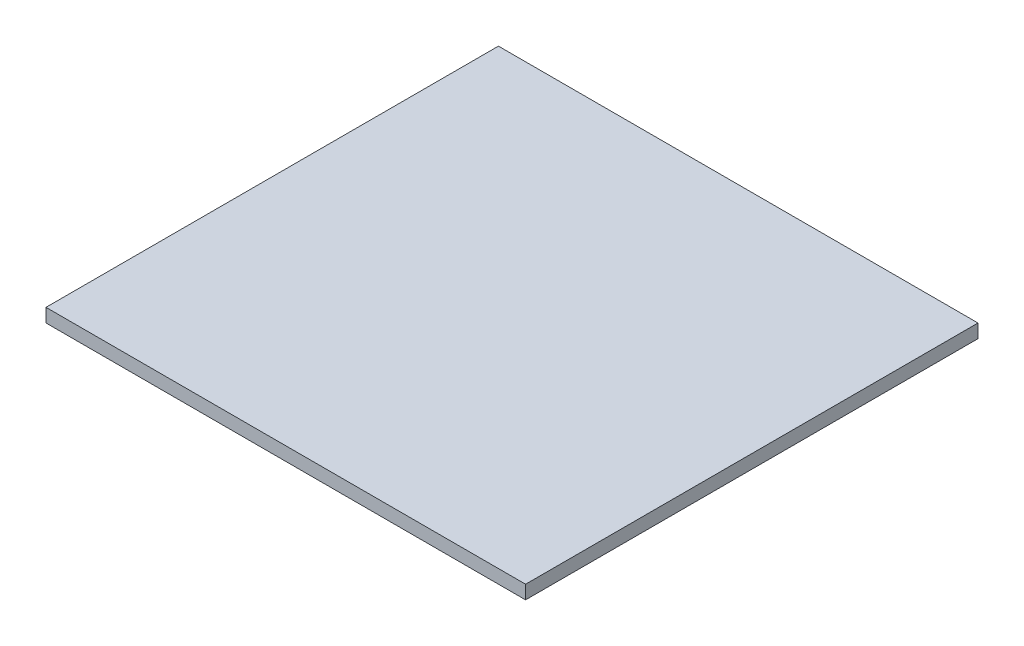
ISO-10303-21;
HEADER;
FILE_DESCRIPTION(('STEP AP214'),'2;1');
FILE_NAME('part.step','',(''),(''),'','','');
FILE_SCHEMA(('AUTOMOTIVE_DESIGN { 1 0 10303 214 1 1 1 1 }'));
ENDSEC;
DATA;
#1=APPLICATION_CONTEXT('core data for automotive mechanical design processes');
#2=APPLICATION_PROTOCOL_DEFINITION('international standard','automotive_design',2000,#1);
#3=PRODUCT_CONTEXT('',#1,'mechanical');
#4=PRODUCT('Part','Part','',(#3));
#5=PRODUCT_RELATED_PRODUCT_CATEGORY('part','',(#4));
#6=PRODUCT_DEFINITION_FORMATION('','',#4);
#7=PRODUCT_DEFINITION_CONTEXT('part definition',#1,'design');
#8=PRODUCT_DEFINITION('design','',#6,#7);
#9=PRODUCT_DEFINITION_SHAPE('','',#8);
#10=(LENGTH_UNIT() NAMED_UNIT(*) SI_UNIT(.MILLI.,.METRE.));
#11=(NAMED_UNIT(*) PLANE_ANGLE_UNIT() SI_UNIT($,.RADIAN.));
#12=(NAMED_UNIT(*) SI_UNIT($,.STERADIAN.) SOLID_ANGLE_UNIT());
#13=UNCERTAINTY_MEASURE_WITH_UNIT(LENGTH_MEASURE(1.E-05),#10,'distance_accuracy_value','');
#14=(GEOMETRIC_REPRESENTATION_CONTEXT(3) GLOBAL_UNCERTAINTY_ASSIGNED_CONTEXT((#13)) GLOBAL_UNIT_ASSIGNED_CONTEXT((#10,
#11,#12)) REPRESENTATION_CONTEXT('',''));
#15=CARTESIAN_POINT('',(0.,0.,0.));
#16=DIRECTION('',(0.,0.,1.));
#17=DIRECTION('',(1.,0.,0.));
#18=AXIS2_PLACEMENT_3D('',#15,#16,#17);
#19=CARTESIAN_POINT('',(79.5,4.5,75.));
#20=DIRECTION('',(-1.,0.,0.));
#21=DIRECTION('',(0.,0.,1.));
#22=AXIS2_PLACEMENT_3D('',#19,#20,#21);
#23=PLANE('',#22);
#24=DIRECTION('',(0.,0.,-1.));
#25=VECTOR('',#24,1.);
#26=CARTESIAN_POINT('',(79.5,0.,75.));
#27=LINE('',#26,#25);
#28=CARTESIAN_POINT('',(79.5,0.,75.));
#29=VERTEX_POINT('',#28);
#30=CARTESIAN_POINT('',(79.5,0.,-75.));
#31=VERTEX_POINT('',#30);
#32=EDGE_CURVE('E110',#29,#31,#27,.T.);
#33=ORIENTED_EDGE('',*,*,#32,.T.);
#34=DIRECTION('',(0.,-1.,0.));
#35=VECTOR('',#34,1.);
#36=CARTESIAN_POINT('',(79.5,4.5,-75.));
#37=LINE('',#36,#35);
#38=CARTESIAN_POINT('',(79.5,4.5,-75.));
#39=VERTEX_POINT('',#38);
#40=EDGE_CURVE('E11',#39,#31,#37,.T.);
#41=ORIENTED_EDGE('',*,*,#40,.F.);
#42=DIRECTION('',(0.,0.,-1.));
#43=VECTOR('',#42,1.);
#44=CARTESIAN_POINT('',(79.5,4.5,75.));
#45=LINE('',#44,#43);
#46=CARTESIAN_POINT('',(79.5,4.5,75.));
#47=VERTEX_POINT('',#46);
#48=EDGE_CURVE('E94',#47,#39,#45,.T.);
#49=ORIENTED_EDGE('',*,*,#48,.F.);
#50=DIRECTION('',(0.,-1.,0.));
#51=VECTOR('',#50,1.);
#52=CARTESIAN_POINT('',(79.5,4.5,75.));
#53=LINE('',#52,#51);
#54=EDGE_CURVE('E106',#47,#29,#53,.T.);
#55=ORIENTED_EDGE('',*,*,#54,.T.);
#56=EDGE_LOOP('',(#33,#41,#49,#55));
#57=FACE_BOUND('',#56,.T.);
#58=ADVANCED_FACE('F42',(#57),#23,.F.);
#59=CARTESIAN_POINT('',(-79.5,4.5,-75.));
#60=DIRECTION('',(0.,0.,1.));
#61=DIRECTION('',(1.,0.,0.));
#62=AXIS2_PLACEMENT_3D('',#59,#60,#61);
#63=PLANE('',#62);
#64=DIRECTION('',(-1.,0.,0.));
#65=VECTOR('',#64,1.);
#66=CARTESIAN_POINT('',(-79.5,0.,-75.));
#67=LINE('',#66,#65);
#68=CARTESIAN_POINT('',(-79.5,0.,-75.));
#69=VERTEX_POINT('',#68);
#70=EDGE_CURVE('E99',#31,#69,#67,.T.);
#71=ORIENTED_EDGE('',*,*,#70,.T.);
#72=DIRECTION('',(0.,-1.,0.));
#73=VECTOR('',#72,1.);
#74=CARTESIAN_POINT('',(-79.5,4.5,-75.));
#75=LINE('',#74,#73);
#76=CARTESIAN_POINT('',(-79.5,4.5,-75.));
#77=VERTEX_POINT('',#76);
#78=EDGE_CURVE('E51',#77,#69,#75,.T.);
#79=ORIENTED_EDGE('',*,*,#78,.F.);
#80=DIRECTION('',(-1.,0.,0.));
#81=VECTOR('',#80,1.);
#82=CARTESIAN_POINT('',(-79.5,4.5,-75.));
#83=LINE('',#82,#81);
#84=EDGE_CURVE('E89',#39,#77,#83,.T.);
#85=ORIENTED_EDGE('',*,*,#84,.F.);
#86=ORIENTED_EDGE('',*,*,#40,.T.);
#87=EDGE_LOOP('',(#71,#79,#85,#86));
#88=FACE_BOUND('',#87,.T.);
#89=ADVANCED_FACE('F98',(#88),#63,.F.);
#90=CARTESIAN_POINT('',(-79.5,4.5,75.));
#91=DIRECTION('',(1.,0.,0.));
#92=DIRECTION('',(0.,0.,-1.));
#93=AXIS2_PLACEMENT_3D('',#90,#91,#92);
#94=PLANE('',#93);
#95=DIRECTION('',(0.,0.,1.));
#96=VECTOR('',#95,1.);
#97=CARTESIAN_POINT('',(-79.5,0.,75.));
#98=LINE('',#97,#96);
#99=CARTESIAN_POINT('',(-79.5,0.,75.));
#100=VERTEX_POINT('',#99);
#101=EDGE_CURVE('E76',#69,#100,#98,.T.);
#102=ORIENTED_EDGE('',*,*,#101,.T.);
#103=DIRECTION('',(0.,-1.,0.));
#104=VECTOR('',#103,1.);
#105=CARTESIAN_POINT('',(-79.5,4.5,75.));
#106=LINE('',#105,#104);
#107=CARTESIAN_POINT('',(-79.5,4.5,75.));
#108=VERTEX_POINT('',#107);
#109=EDGE_CURVE('E101',#108,#100,#106,.T.);
#110=ORIENTED_EDGE('',*,*,#109,.F.);
#111=DIRECTION('',(0.,0.,1.));
#112=VECTOR('',#111,1.);
#113=CARTESIAN_POINT('',(-79.5,4.5,75.));
#114=LINE('',#113,#112);
#115=EDGE_CURVE('E92',#77,#108,#114,.T.);
#116=ORIENTED_EDGE('',*,*,#115,.F.);
#117=ORIENTED_EDGE('',*,*,#78,.T.);
#118=EDGE_LOOP('',(#102,#110,#116,#117));
#119=FACE_BOUND('',#118,.T.);
#120=ADVANCED_FACE('F102',(#119),#94,.F.);
#121=CARTESIAN_POINT('',(-79.5,4.5,75.));
#122=DIRECTION('',(0.,0.,-1.));
#123=DIRECTION('',(-1.,0.,0.));
#124=AXIS2_PLACEMENT_3D('',#121,#122,#123);
#125=PLANE('',#124);
#126=DIRECTION('',(1.,0.,0.));
#127=VECTOR('',#126,1.);
#128=CARTESIAN_POINT('',(-79.5,0.,75.));
#129=LINE('',#128,#127);
#130=EDGE_CURVE('E82',#100,#29,#129,.T.);
#131=ORIENTED_EDGE('',*,*,#130,.T.);
#132=ORIENTED_EDGE('',*,*,#54,.F.);
#133=DIRECTION('',(1.,0.,0.));
#134=VECTOR('',#133,1.);
#135=CARTESIAN_POINT('',(-79.5,4.5,75.));
#136=LINE('',#135,#134);
#137=EDGE_CURVE('E59',#108,#47,#136,.T.);
#138=ORIENTED_EDGE('',*,*,#137,.F.);
#139=ORIENTED_EDGE('',*,*,#109,.T.);
#140=EDGE_LOOP('',(#131,#132,#138,#139));
#141=FACE_BOUND('',#140,.T.);
#142=ADVANCED_FACE('F123',(#141),#125,.F.);
#143=CARTESIAN_POINT('',(0.,4.5,0.));
#144=DIRECTION('',(0.,-1.,0.));
#145=DIRECTION('',(0.,0.,-1.));
#146=AXIS2_PLACEMENT_3D('',#143,#144,#145);
#147=PLANE('',#146);
#148=ORIENTED_EDGE('',*,*,#48,.T.);
#149=ORIENTED_EDGE('',*,*,#84,.T.);
#150=ORIENTED_EDGE('',*,*,#115,.T.);
#151=ORIENTED_EDGE('',*,*,#137,.T.);
#152=EDGE_LOOP('',(#148,#149,#150,#151));
#153=FACE_BOUND('',#152,.T.);
#154=ADVANCED_FACE('F90',(#153),#147,.F.);
#155=CARTESIAN_POINT('',(0.,0.,0.));
#156=DIRECTION('',(0.,-1.,0.));
#157=DIRECTION('',(0.,0.,-1.));
#158=AXIS2_PLACEMENT_3D('',#155,#156,#157);
#159=PLANE('',#158);
#160=ORIENTED_EDGE('',*,*,#32,.F.);
#161=ORIENTED_EDGE('',*,*,#130,.F.);
#162=ORIENTED_EDGE('',*,*,#101,.F.);
#163=ORIENTED_EDGE('',*,*,#70,.F.);
#164=EDGE_LOOP('',(#160,#161,#162,#163));
#165=FACE_BOUND('',#164,.T.);
#166=ADVANCED_FACE('F126',(#165),#159,.T.);
#167=CLOSED_SHELL('',(#58,#89,#120,#142,#154,#166));
#168=MANIFOLD_SOLID_BREP('B2',#167);
#169=ADVANCED_BREP_SHAPE_REPRESENTATION('',(#18,#168),#14);
#170=SHAPE_DEFINITION_REPRESENTATION(#9,#169);
ENDSEC;
END-ISO-10303-21;
